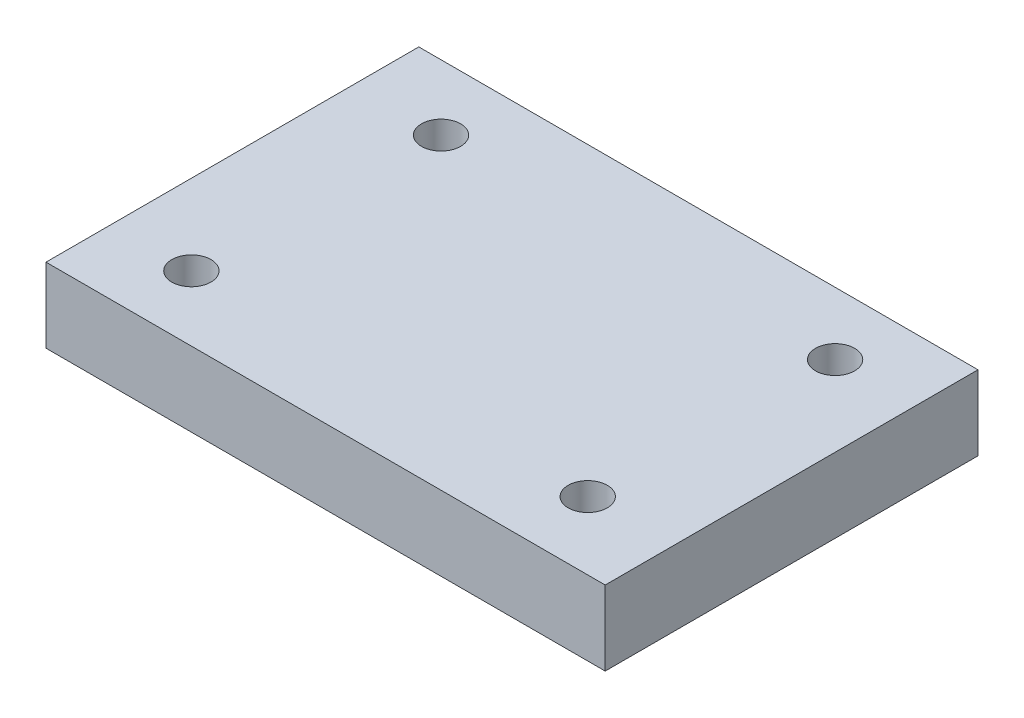
ISO-10303-21;
HEADER;
FILE_DESCRIPTION(('STEP AP214'),'2;1');
FILE_NAME('part.step','',(''),(''),'','','');
FILE_SCHEMA(('AUTOMOTIVE_DESIGN { 1 0 10303 214 1 1 1 1 }'));
ENDSEC;
DATA;
#1=APPLICATION_CONTEXT('core data for automotive mechanical design processes');
#2=APPLICATION_PROTOCOL_DEFINITION('international standard','automotive_design',2000,#1);
#3=PRODUCT_CONTEXT('',#1,'mechanical');
#4=PRODUCT('Part','Part','',(#3));
#5=PRODUCT_RELATED_PRODUCT_CATEGORY('part','',(#4));
#6=PRODUCT_DEFINITION_FORMATION('','',#4);
#7=PRODUCT_DEFINITION_CONTEXT('part definition',#1,'design');
#8=PRODUCT_DEFINITION('design','',#6,#7);
#9=PRODUCT_DEFINITION_SHAPE('','',#8);
#10=(LENGTH_UNIT() NAMED_UNIT(*) SI_UNIT(.MILLI.,.METRE.));
#11=(NAMED_UNIT(*) PLANE_ANGLE_UNIT() SI_UNIT($,.RADIAN.));
#12=(NAMED_UNIT(*) SI_UNIT($,.STERADIAN.) SOLID_ANGLE_UNIT());
#13=UNCERTAINTY_MEASURE_WITH_UNIT(LENGTH_MEASURE(1.E-05),#10,'distance_accuracy_value','');
#14=(GEOMETRIC_REPRESENTATION_CONTEXT(3) GLOBAL_UNCERTAINTY_ASSIGNED_CONTEXT((#13)) GLOBAL_UNIT_ASSIGNED_CONTEXT((#10,
#11,#12)) REPRESENTATION_CONTEXT('',''));
#15=CARTESIAN_POINT('',(0.,0.,0.));
#16=DIRECTION('',(0.,0.,1.));
#17=DIRECTION('',(1.,0.,0.));
#18=AXIS2_PLACEMENT_3D('',#15,#16,#17);
#19=CARTESIAN_POINT('',(0.,4.,0.));
#20=DIRECTION('',(1.,0.,0.));
#21=DIRECTION('',(0.,0.,-1.));
#22=AXIS2_PLACEMENT_3D('',#19,#20,#21);
#23=PLANE('',#22);
#24=DIRECTION('',(0.,0.,1.));
#25=VECTOR('',#24,1.);
#26=CARTESIAN_POINT('',(0.,0.,0.));
#27=LINE('',#26,#25);
#28=CARTESIAN_POINT('',(0.,0.,-20.));
#29=VERTEX_POINT('',#28);
#30=CARTESIAN_POINT('',(0.,0.,0.));
#31=VERTEX_POINT('',#30);
#32=EDGE_CURVE('E110',#29,#31,#27,.T.);
#33=ORIENTED_EDGE('',*,*,#32,.T.);
#34=DIRECTION('',(0.,-1.,0.));
#35=VECTOR('',#34,1.);
#36=CARTESIAN_POINT('',(0.,4.,0.));
#37=LINE('',#36,#35);
#38=CARTESIAN_POINT('',(0.,4.,0.));
#39=VERTEX_POINT('',#38);
#40=EDGE_CURVE('E11',#39,#31,#37,.T.);
#41=ORIENTED_EDGE('',*,*,#40,.F.);
#42=DIRECTION('',(0.,0.,1.));
#43=VECTOR('',#42,1.);
#44=CARTESIAN_POINT('',(0.,4.,0.));
#45=LINE('',#44,#43);
#46=CARTESIAN_POINT('',(0.,4.,-20.));
#47=VERTEX_POINT('',#46);
#48=EDGE_CURVE('E93',#47,#39,#45,.T.);
#49=ORIENTED_EDGE('',*,*,#48,.F.);
#50=DIRECTION('',(0.,-1.,0.));
#51=VECTOR('',#50,1.);
#52=CARTESIAN_POINT('',(0.,4.,-20.));
#53=LINE('',#52,#51);
#54=EDGE_CURVE('E106',#47,#29,#53,.T.);
#55=ORIENTED_EDGE('',*,*,#54,.T.);
#56=EDGE_LOOP('',(#33,#41,#49,#55));
#57=FACE_BOUND('',#56,.T.);
#58=ADVANCED_FACE('F39',(#57),#23,.F.);
#59=CARTESIAN_POINT('',(0.,4.,0.));
#60=DIRECTION('',(0.,0.,-1.));
#61=DIRECTION('',(-1.,0.,0.));
#62=AXIS2_PLACEMENT_3D('',#59,#60,#61);
#63=PLANE('',#62);
#64=DIRECTION('',(1.,0.,0.));
#65=VECTOR('',#64,1.);
#66=CARTESIAN_POINT('',(0.,0.,0.));
#67=LINE('',#66,#65);
#68=CARTESIAN_POINT('',(30.,0.,0.));
#69=VERTEX_POINT('',#68);
#70=EDGE_CURVE('E98',#31,#69,#67,.T.);
#71=ORIENTED_EDGE('',*,*,#70,.T.);
#72=DIRECTION('',(0.,-1.,0.));
#73=VECTOR('',#72,1.);
#74=CARTESIAN_POINT('',(30.,4.,0.));
#75=LINE('',#74,#73);
#76=CARTESIAN_POINT('',(30.,4.,0.));
#77=VERTEX_POINT('',#76);
#78=EDGE_CURVE('E49',#77,#69,#75,.T.);
#79=ORIENTED_EDGE('',*,*,#78,.F.);
#80=DIRECTION('',(1.,0.,0.));
#81=VECTOR('',#80,1.);
#82=CARTESIAN_POINT('',(0.,4.,0.));
#83=LINE('',#82,#81);
#84=EDGE_CURVE('E88',#39,#77,#83,.T.);
#85=ORIENTED_EDGE('',*,*,#84,.F.);
#86=ORIENTED_EDGE('',*,*,#40,.T.);
#87=EDGE_LOOP('',(#71,#79,#85,#86));
#88=FACE_BOUND('',#87,.T.);
#89=ADVANCED_FACE('F97',(#88),#63,.F.);
#90=CARTESIAN_POINT('',(30.,4.,0.));
#91=DIRECTION('',(-1.,0.,0.));
#92=DIRECTION('',(0.,0.,1.));
#93=AXIS2_PLACEMENT_3D('',#90,#91,#92);
#94=PLANE('',#93);
#95=DIRECTION('',(0.,0.,-1.));
#96=VECTOR('',#95,1.);
#97=CARTESIAN_POINT('',(30.,0.,0.));
#98=LINE('',#97,#96);
#99=CARTESIAN_POINT('',(30.,0.,-20.));
#100=VERTEX_POINT('',#99);
#101=EDGE_CURVE('E75',#69,#100,#98,.T.);
#102=ORIENTED_EDGE('',*,*,#101,.T.);
#103=DIRECTION('',(0.,-1.,0.));
#104=VECTOR('',#103,1.);
#105=CARTESIAN_POINT('',(30.,4.,-20.));
#106=LINE('',#105,#104);
#107=CARTESIAN_POINT('',(30.,4.,-20.));
#108=VERTEX_POINT('',#107);
#109=EDGE_CURVE('E100',#108,#100,#106,.T.);
#110=ORIENTED_EDGE('',*,*,#109,.F.);
#111=DIRECTION('',(0.,0.,-1.));
#112=VECTOR('',#111,1.);
#113=CARTESIAN_POINT('',(30.,4.,0.));
#114=LINE('',#113,#112);
#115=EDGE_CURVE('E91',#77,#108,#114,.T.);
#116=ORIENTED_EDGE('',*,*,#115,.F.);
#117=ORIENTED_EDGE('',*,*,#78,.T.);
#118=EDGE_LOOP('',(#102,#110,#116,#117));
#119=FACE_BOUND('',#118,.T.);
#120=ADVANCED_FACE('F102',(#119),#94,.F.);
#121=CARTESIAN_POINT('',(0.,4.,-20.));
#122=DIRECTION('',(0.,0.,1.));
#123=DIRECTION('',(1.,0.,0.));
#124=AXIS2_PLACEMENT_3D('',#121,#122,#123);
#125=PLANE('',#124);
#126=DIRECTION('',(-1.,0.,0.));
#127=VECTOR('',#126,1.);
#128=CARTESIAN_POINT('',(0.,0.,-20.));
#129=LINE('',#128,#127);
#130=EDGE_CURVE('E81',#100,#29,#129,.T.);
#131=ORIENTED_EDGE('',*,*,#130,.T.);
#132=ORIENTED_EDGE('',*,*,#54,.F.);
#133=DIRECTION('',(-1.,0.,0.));
#134=VECTOR('',#133,1.);
#135=CARTESIAN_POINT('',(0.,4.,-20.));
#136=LINE('',#135,#134);
#137=EDGE_CURVE('E58',#108,#47,#136,.T.);
#138=ORIENTED_EDGE('',*,*,#137,.F.);
#139=ORIENTED_EDGE('',*,*,#109,.T.);
#140=EDGE_LOOP('',(#131,#132,#138,#139));
#141=FACE_BOUND('',#140,.T.);
#142=ADVANCED_FACE('F156',(#141),#125,.F.);
#143=CARTESIAN_POINT('',(0.,4.,0.));
#144=DIRECTION('',(0.,-1.,0.));
#145=DIRECTION('',(0.,0.,-1.));
#146=AXIS2_PLACEMENT_3D('',#143,#144,#145);
#147=PLANE('',#146);
#148=CARTESIAN_POINT('',(4.69365270704464,4.,-16.5));
#149=DIRECTION('',(0.,1.,0.));
#150=DIRECTION('',(0.,0.,1.));
#151=AXIS2_PLACEMENT_3D('',#148,#149,#150);
#152=CIRCLE('',#151,1.05);
#153=CARTESIAN_POINT('',(4.69365270704464,4.,-15.45));
#154=VERTEX_POINT('',#153);
#155=EDGE_CURVE('E238',#154,#154,#152,.T.);
#156=ORIENTED_EDGE('',*,*,#155,.F.);
#157=EDGE_LOOP('',(#156));
#158=FACE_BOUND('',#157,.T.);
#159=CARTESIAN_POINT('',(25.4232107713385,4.,-3.63917986169688));
#160=DIRECTION('',(0.,1.,0.));
#161=DIRECTION('',(0.,0.,1.));
#162=AXIS2_PLACEMENT_3D('',#159,#160,#161);
#163=CIRCLE('',#162,1.05);
#164=CARTESIAN_POINT('',(25.4232107713385,4.,-2.58917986169688));
#165=VERTEX_POINT('',#164);
#166=EDGE_CURVE('E235',#165,#165,#163,.T.);
#167=ORIENTED_EDGE('',*,*,#166,.F.);
#168=EDGE_LOOP('',(#167));
#169=FACE_BOUND('',#168,.T.);
#170=CARTESIAN_POINT('',(25.6936527070446,4.,-16.6391798616969));
#171=DIRECTION('',(0.,1.,0.));
#172=DIRECTION('',(0.,0.,1.));
#173=AXIS2_PLACEMENT_3D('',#170,#171,#172);
#174=CIRCLE('',#173,1.05);
#175=CARTESIAN_POINT('',(25.6936527070446,4.,-15.5891798616969));
#176=VERTEX_POINT('',#175);
#177=EDGE_CURVE('E239',#176,#176,#174,.T.);
#178=ORIENTED_EDGE('',*,*,#177,.F.);
#179=EDGE_LOOP('',(#178));
#180=FACE_BOUND('',#179,.T.);
#181=CARTESIAN_POINT('',(4.30251211454416,4.,-3.49664202366634));
#182=DIRECTION('',(0.,1.,0.));
#183=DIRECTION('',(0.,0.,1.));
#184=AXIS2_PLACEMENT_3D('',#181,#182,#183);
#185=CIRCLE('',#184,1.05);
#186=CARTESIAN_POINT('',(4.30251211454416,4.,-2.44664202366634));
#187=VERTEX_POINT('',#186);
#188=EDGE_CURVE('E129',#187,#187,#185,.T.);
#189=ORIENTED_EDGE('',*,*,#188,.F.);
#190=EDGE_LOOP('',(#189));
#191=FACE_BOUND('',#190,.T.);
#192=ORIENTED_EDGE('',*,*,#48,.T.);
#193=ORIENTED_EDGE('',*,*,#84,.T.);
#194=ORIENTED_EDGE('',*,*,#115,.T.);
#195=ORIENTED_EDGE('',*,*,#137,.T.);
#196=EDGE_LOOP('',(#192,#193,#194,#195));
#197=FACE_BOUND('',#196,.T.);
#198=ADVANCED_FACE('F89',(#158,#169,#180,#191,#197),#147,.F.);
#199=CARTESIAN_POINT('',(0.,0.,0.));
#200=DIRECTION('',(0.,-1.,0.));
#201=DIRECTION('',(0.,0.,-1.));
#202=AXIS2_PLACEMENT_3D('',#199,#200,#201);
#203=PLANE('',#202);
#204=CARTESIAN_POINT('',(4.69365270704464,0.,-16.5));
#205=DIRECTION('',(0.,-1.,0.));
#206=DIRECTION('',(0.,0.,-1.));
#207=AXIS2_PLACEMENT_3D('',#204,#205,#206);
#208=CIRCLE('',#207,1.05);
#209=CARTESIAN_POINT('',(4.69365270704464,0.,-17.55));
#210=VERTEX_POINT('',#209);
#211=EDGE_CURVE('E42',#210,#210,#208,.T.);
#212=ORIENTED_EDGE('',*,*,#211,.F.);
#213=EDGE_LOOP('',(#212));
#214=FACE_BOUND('',#213,.T.);
#215=CARTESIAN_POINT('',(25.4232107713385,0.,-3.63917986169688));
#216=DIRECTION('',(0.,-1.,0.));
#217=DIRECTION('',(0.,0.,-1.));
#218=AXIS2_PLACEMENT_3D('',#215,#216,#217);
#219=CIRCLE('',#218,1.05);
#220=CARTESIAN_POINT('',(25.4232107713385,0.,-4.68917986169688));
#221=VERTEX_POINT('',#220);
#222=EDGE_CURVE('E132',#221,#221,#219,.T.);
#223=ORIENTED_EDGE('',*,*,#222,.F.);
#224=EDGE_LOOP('',(#223));
#225=FACE_BOUND('',#224,.T.);
#226=CARTESIAN_POINT('',(25.6936527070446,0.,-16.6391798616969));
#227=DIRECTION('',(0.,-1.,0.));
#228=DIRECTION('',(0.,0.,-1.));
#229=AXIS2_PLACEMENT_3D('',#226,#227,#228);
#230=CIRCLE('',#229,1.05);
#231=CARTESIAN_POINT('',(25.6936527070446,0.,-17.6891798616969));
#232=VERTEX_POINT('',#231);
#233=EDGE_CURVE('E128',#232,#232,#230,.T.);
#234=ORIENTED_EDGE('',*,*,#233,.F.);
#235=EDGE_LOOP('',(#234));
#236=FACE_BOUND('',#235,.T.);
#237=CARTESIAN_POINT('',(4.30251211454416,0.,-3.49664202366634));
#238=DIRECTION('',(0.,-1.,0.));
#239=DIRECTION('',(0.,0.,-1.));
#240=AXIS2_PLACEMENT_3D('',#237,#238,#239);
#241=CIRCLE('',#240,1.05);
#242=CARTESIAN_POINT('',(4.30251211454416,0.,-4.54664202366634));
#243=VERTEX_POINT('',#242);
#244=EDGE_CURVE('E124',#243,#243,#241,.T.);
#245=ORIENTED_EDGE('',*,*,#244,.F.);
#246=EDGE_LOOP('',(#245));
#247=FACE_BOUND('',#246,.T.);
#248=ORIENTED_EDGE('',*,*,#32,.F.);
#249=ORIENTED_EDGE('',*,*,#130,.F.);
#250=ORIENTED_EDGE('',*,*,#101,.F.);
#251=ORIENTED_EDGE('',*,*,#70,.F.);
#252=EDGE_LOOP('',(#248,#249,#250,#251));
#253=FACE_BOUND('',#252,.T.);
#254=ADVANCED_FACE('F144',(#214,#225,#236,#247,#253),#203,.T.);
#255=CARTESIAN_POINT('',(4.30251211454416,-6.,-3.49664202366634));
#256=DIRECTION('',(0.,1.,0.));
#257=DIRECTION('',(0.,0.,1.));
#258=AXIS2_PLACEMENT_3D('',#255,#256,#257);
#259=CYLINDRICAL_SURFACE('',#258,1.05);
#260=ORIENTED_EDGE('',*,*,#244,.T.);
#261=EDGE_LOOP('',(#260));
#262=FACE_BOUND('',#261,.T.);
#263=ORIENTED_EDGE('',*,*,#188,.T.);
#264=EDGE_LOOP('',(#263));
#265=FACE_BOUND('',#264,.T.);
#266=ADVANCED_FACE('F147',(#262,#265),#259,.F.);
#267=CARTESIAN_POINT('',(25.6936527070446,-6.,-16.6391798616969));
#268=DIRECTION('',(0.,1.,0.));
#269=DIRECTION('',(0.,0.,1.));
#270=AXIS2_PLACEMENT_3D('',#267,#268,#269);
#271=CYLINDRICAL_SURFACE('',#270,1.05);
#272=ORIENTED_EDGE('',*,*,#233,.T.);
#273=EDGE_LOOP('',(#272));
#274=FACE_BOUND('',#273,.T.);
#275=ORIENTED_EDGE('',*,*,#177,.T.);
#276=EDGE_LOOP('',(#275));
#277=FACE_BOUND('',#276,.T.);
#278=ADVANCED_FACE('F201',(#274,#277),#271,.F.);
#279=CARTESIAN_POINT('',(25.4232107713385,-6.,-3.63917986169688));
#280=DIRECTION('',(0.,1.,0.));
#281=DIRECTION('',(0.,0.,1.));
#282=AXIS2_PLACEMENT_3D('',#279,#280,#281);
#283=CYLINDRICAL_SURFACE('',#282,1.05);
#284=ORIENTED_EDGE('',*,*,#222,.T.);
#285=EDGE_LOOP('',(#284));
#286=FACE_BOUND('',#285,.T.);
#287=ORIENTED_EDGE('',*,*,#166,.T.);
#288=EDGE_LOOP('',(#287));
#289=FACE_BOUND('',#288,.T.);
#290=ADVANCED_FACE('F211',(#286,#289),#283,.F.);
#291=CARTESIAN_POINT('',(4.69365270704464,-6.,-16.5));
#292=DIRECTION('',(0.,1.,0.));
#293=DIRECTION('',(0.,0.,1.));
#294=AXIS2_PLACEMENT_3D('',#291,#292,#293);
#295=CYLINDRICAL_SURFACE('',#294,1.05);
#296=ORIENTED_EDGE('',*,*,#211,.T.);
#297=EDGE_LOOP('',(#296));
#298=FACE_BOUND('',#297,.T.);
#299=ORIENTED_EDGE('',*,*,#155,.T.);
#300=EDGE_LOOP('',(#299));
#301=FACE_BOUND('',#300,.T.);
#302=ADVANCED_FACE('F141',(#298,#301),#295,.F.);
#303=CLOSED_SHELL('',(#58,#89,#120,#142,#198,#254,#266,#278,#290,#302));
#304=MANIFOLD_SOLID_BREP('B2',#303);
#305=ADVANCED_BREP_SHAPE_REPRESENTATION('',(#18,#304),#14);
#306=SHAPE_DEFINITION_REPRESENTATION(#9,#305);
ENDSEC;
END-ISO-10303-21;
